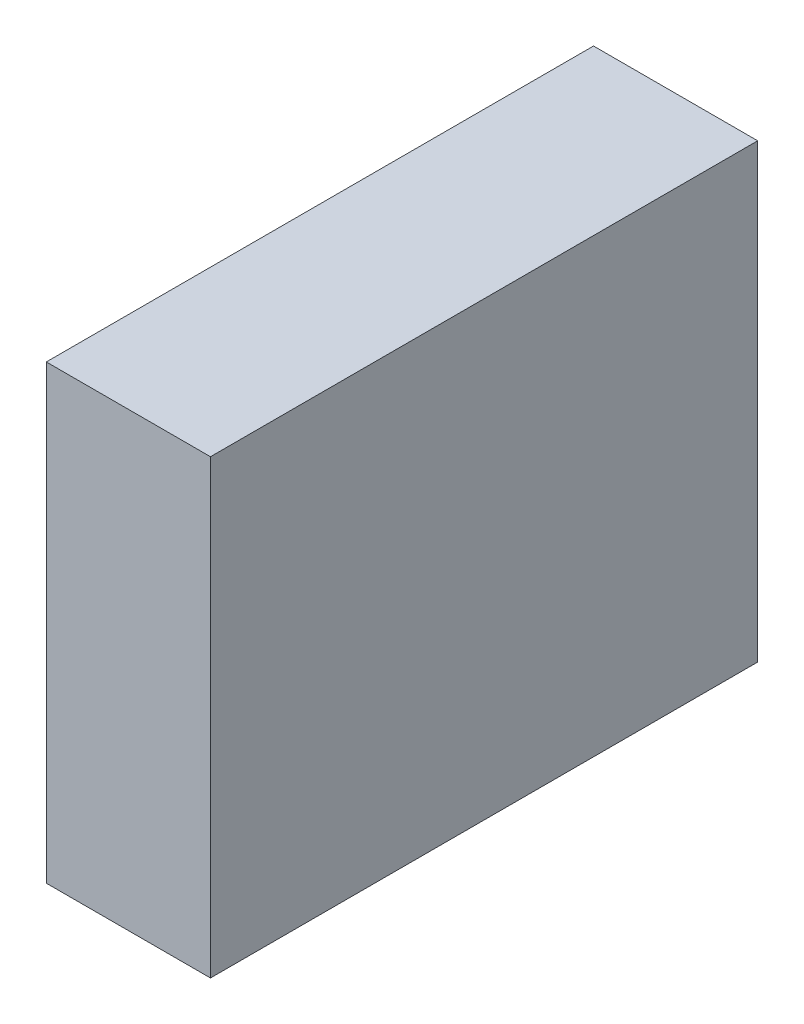
ISO-10303-21;
HEADER;
FILE_DESCRIPTION(('STEP AP214'),'2;1');
FILE_NAME('part.step','',(''),(''),'','','');
FILE_SCHEMA(('AUTOMOTIVE_DESIGN { 1 0 10303 214 1 1 1 1 }'));
ENDSEC;
DATA;
#1=APPLICATION_CONTEXT('core data for automotive mechanical design processes');
#2=APPLICATION_PROTOCOL_DEFINITION('international standard','automotive_design',2000,#1);
#3=PRODUCT_CONTEXT('',#1,'mechanical');
#4=PRODUCT('Part','Part','',(#3));
#5=PRODUCT_RELATED_PRODUCT_CATEGORY('part','',(#4));
#6=PRODUCT_DEFINITION_FORMATION('','',#4);
#7=PRODUCT_DEFINITION_CONTEXT('part definition',#1,'design');
#8=PRODUCT_DEFINITION('design','',#6,#7);
#9=PRODUCT_DEFINITION_SHAPE('','',#8);
#10=(LENGTH_UNIT() NAMED_UNIT(*) SI_UNIT(.MILLI.,.METRE.));
#11=(NAMED_UNIT(*) PLANE_ANGLE_UNIT() SI_UNIT($,.RADIAN.));
#12=(NAMED_UNIT(*) SI_UNIT($,.STERADIAN.) SOLID_ANGLE_UNIT());
#13=UNCERTAINTY_MEASURE_WITH_UNIT(LENGTH_MEASURE(1.E-05),#10,'distance_accuracy_value','');
#14=(GEOMETRIC_REPRESENTATION_CONTEXT(3) GLOBAL_UNCERTAINTY_ASSIGNED_CONTEXT((#13)) GLOBAL_UNIT_ASSIGNED_CONTEXT((#10,
#11,#12)) REPRESENTATION_CONTEXT('',''));
#15=CARTESIAN_POINT('',(0.,0.,0.));
#16=DIRECTION('',(0.,0.,1.));
#17=DIRECTION('',(1.,0.,0.));
#18=AXIS2_PLACEMENT_3D('',#15,#16,#17);
#19=CARTESIAN_POINT('',(0.,104.775,0.));
#20=DIRECTION('',(1.,0.,0.));
#21=DIRECTION('',(0.,0.,-1.));
#22=AXIS2_PLACEMENT_3D('',#19,#20,#21);
#23=PLANE('',#22);
#24=DIRECTION('',(0.,0.,1.));
#25=VECTOR('',#24,1.);
#26=CARTESIAN_POINT('',(0.,0.,0.));
#27=LINE('',#26,#25);
#28=CARTESIAN_POINT('',(0.,0.,-127.));
#29=VERTEX_POINT('',#28);
#30=CARTESIAN_POINT('',(0.,0.,0.));
#31=VERTEX_POINT('',#30);
#32=EDGE_CURVE('E101',#29,#31,#27,.T.);
#33=ORIENTED_EDGE('',*,*,#32,.T.);
#34=DIRECTION('',(0.,-1.,0.));
#35=VECTOR('',#34,1.);
#36=CARTESIAN_POINT('',(0.,104.775,0.));
#37=LINE('',#36,#35);
#38=CARTESIAN_POINT('',(0.,104.775,0.));
#39=VERTEX_POINT('',#38);
#40=EDGE_CURVE('E11',#39,#31,#37,.T.);
#41=ORIENTED_EDGE('',*,*,#40,.F.);
#42=DIRECTION('',(0.,0.,1.));
#43=VECTOR('',#42,1.);
#44=CARTESIAN_POINT('',(0.,104.775,0.));
#45=LINE('',#44,#43);
#46=CARTESIAN_POINT('',(0.,104.775,-127.));
#47=VERTEX_POINT('',#46);
#48=EDGE_CURVE('E89',#47,#39,#45,.T.);
#49=ORIENTED_EDGE('',*,*,#48,.F.);
#50=DIRECTION('',(0.,-1.,0.));
#51=VECTOR('',#50,1.);
#52=CARTESIAN_POINT('',(0.,104.775,-127.));
#53=LINE('',#52,#51);
#54=EDGE_CURVE('E97',#47,#29,#53,.T.);
#55=ORIENTED_EDGE('',*,*,#54,.T.);
#56=EDGE_LOOP('',(#33,#41,#49,#55));
#57=FACE_BOUND('',#56,.T.);
#58=ADVANCED_FACE('F38',(#57),#23,.F.);
#59=CARTESIAN_POINT('',(0.,104.775,0.));
#60=DIRECTION('',(0.,0.,-1.));
#61=DIRECTION('',(-1.,0.,0.));
#62=AXIS2_PLACEMENT_3D('',#59,#60,#61);
#63=PLANE('',#62);
#64=DIRECTION('',(1.,0.,0.));
#65=VECTOR('',#64,1.);
#66=CARTESIAN_POINT('',(0.,0.,0.));
#67=LINE('',#66,#65);
#68=CARTESIAN_POINT('',(38.1,0.,0.));
#69=VERTEX_POINT('',#68);
#70=EDGE_CURVE('E93',#31,#69,#67,.T.);
#71=ORIENTED_EDGE('',*,*,#70,.T.);
#72=DIRECTION('',(0.,-1.,0.));
#73=VECTOR('',#72,1.);
#74=CARTESIAN_POINT('',(38.1,104.775,0.));
#75=LINE('',#74,#73);
#76=CARTESIAN_POINT('',(38.1,104.775,0.));
#77=VERTEX_POINT('',#76);
#78=EDGE_CURVE('E46',#77,#69,#75,.T.);
#79=ORIENTED_EDGE('',*,*,#78,.F.);
#80=DIRECTION('',(1.,0.,0.));
#81=VECTOR('',#80,1.);
#82=CARTESIAN_POINT('',(0.,104.775,0.));
#83=LINE('',#82,#81);
#84=EDGE_CURVE('E84',#39,#77,#83,.T.);
#85=ORIENTED_EDGE('',*,*,#84,.F.);
#86=ORIENTED_EDGE('',*,*,#40,.T.);
#87=EDGE_LOOP('',(#71,#79,#85,#86));
#88=FACE_BOUND('',#87,.T.);
#89=ADVANCED_FACE('F92',(#88),#63,.F.);
#90=CARTESIAN_POINT('',(38.1,104.775,0.));
#91=DIRECTION('',(-1.,0.,0.));
#92=DIRECTION('',(0.,0.,1.));
#93=AXIS2_PLACEMENT_3D('',#90,#91,#92);
#94=PLANE('',#93);
#95=DIRECTION('',(0.,0.,-1.));
#96=VECTOR('',#95,1.);
#97=CARTESIAN_POINT('',(38.1,0.,0.));
#98=LINE('',#97,#96);
#99=CARTESIAN_POINT('',(38.1,0.,-127.));
#100=VERTEX_POINT('',#99);
#101=EDGE_CURVE('E71',#69,#100,#98,.T.);
#102=ORIENTED_EDGE('',*,*,#101,.T.);
#103=DIRECTION('',(0.,-1.,0.));
#104=VECTOR('',#103,1.);
#105=CARTESIAN_POINT('',(38.1,104.775,-127.));
#106=LINE('',#105,#104);
#107=CARTESIAN_POINT('',(38.1,104.775,-127.));
#108=VERTEX_POINT('',#107);
#109=EDGE_CURVE('E94',#108,#100,#106,.T.);
#110=ORIENTED_EDGE('',*,*,#109,.F.);
#111=DIRECTION('',(0.,0.,-1.));
#112=VECTOR('',#111,1.);
#113=CARTESIAN_POINT('',(38.1,104.775,0.));
#114=LINE('',#113,#112);
#115=EDGE_CURVE('E87',#77,#108,#114,.T.);
#116=ORIENTED_EDGE('',*,*,#115,.F.);
#117=ORIENTED_EDGE('',*,*,#78,.T.);
#118=EDGE_LOOP('',(#102,#110,#116,#117));
#119=FACE_BOUND('',#118,.T.);
#120=ADVANCED_FACE('F95',(#119),#94,.F.);
#121=CARTESIAN_POINT('',(0.,104.775,-127.));
#122=DIRECTION('',(0.,0.,1.));
#123=DIRECTION('',(1.,0.,0.));
#124=AXIS2_PLACEMENT_3D('',#121,#122,#123);
#125=PLANE('',#124);
#126=DIRECTION('',(-1.,0.,0.));
#127=VECTOR('',#126,1.);
#128=CARTESIAN_POINT('',(0.,0.,-127.));
#129=LINE('',#128,#127);
#130=EDGE_CURVE('E77',#100,#29,#129,.T.);
#131=ORIENTED_EDGE('',*,*,#130,.T.);
#132=ORIENTED_EDGE('',*,*,#54,.F.);
#133=DIRECTION('',(-1.,0.,0.));
#134=VECTOR('',#133,1.);
#135=CARTESIAN_POINT('',(0.,104.775,-127.));
#136=LINE('',#135,#134);
#137=EDGE_CURVE('E54',#108,#47,#136,.T.);
#138=ORIENTED_EDGE('',*,*,#137,.F.);
#139=ORIENTED_EDGE('',*,*,#109,.T.);
#140=EDGE_LOOP('',(#131,#132,#138,#139));
#141=FACE_BOUND('',#140,.T.);
#142=ADVANCED_FACE('F108',(#141),#125,.F.);
#143=CARTESIAN_POINT('',(0.,104.775,0.));
#144=DIRECTION('',(0.,-1.,0.));
#145=DIRECTION('',(0.,0.,-1.));
#146=AXIS2_PLACEMENT_3D('',#143,#144,#145);
#147=PLANE('',#146);
#148=ORIENTED_EDGE('',*,*,#48,.T.);
#149=ORIENTED_EDGE('',*,*,#84,.T.);
#150=ORIENTED_EDGE('',*,*,#115,.T.);
#151=ORIENTED_EDGE('',*,*,#137,.T.);
#152=EDGE_LOOP('',(#148,#149,#150,#151));
#153=FACE_BOUND('',#152,.T.);
#154=ADVANCED_FACE('F85',(#153),#147,.F.);
#155=CARTESIAN_POINT('',(0.,0.,0.));
#156=DIRECTION('',(0.,-1.,0.));
#157=DIRECTION('',(0.,0.,-1.));
#158=AXIS2_PLACEMENT_3D('',#155,#156,#157);
#159=PLANE('',#158);
#160=ORIENTED_EDGE('',*,*,#32,.F.);
#161=ORIENTED_EDGE('',*,*,#130,.F.);
#162=ORIENTED_EDGE('',*,*,#101,.F.);
#163=ORIENTED_EDGE('',*,*,#70,.F.);
#164=EDGE_LOOP('',(#160,#161,#162,#163));
#165=FACE_BOUND('',#164,.T.);
#166=ADVANCED_FACE('F111',(#165),#159,.T.);
#167=CLOSED_SHELL('',(#58,#89,#120,#142,#154,#166));
#168=MANIFOLD_SOLID_BREP('B2',#167);
#169=ADVANCED_BREP_SHAPE_REPRESENTATION('',(#18,#168),#14);
#170=SHAPE_DEFINITION_REPRESENTATION(#9,#169);
ENDSEC;
END-ISO-10303-21;
